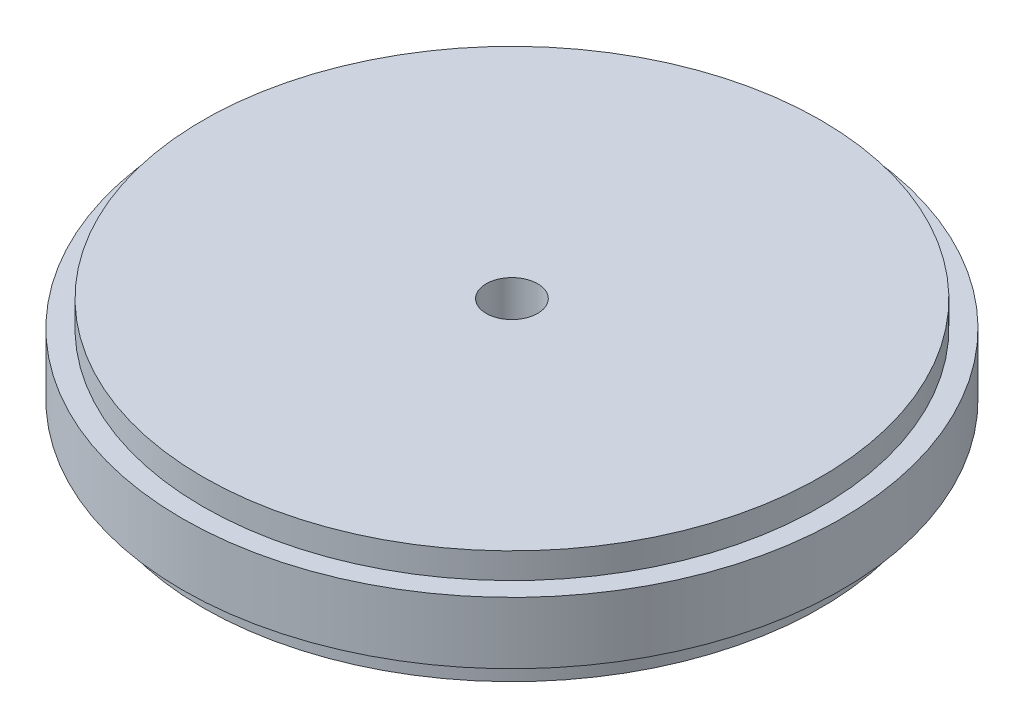
ISO-10303-21;
HEADER;
FILE_DESCRIPTION(('STEP AP214'),'2;1');
FILE_NAME('part.step','',(''),(''),'','','');
FILE_SCHEMA(('AUTOMOTIVE_DESIGN { 1 0 10303 214 1 1 1 1 }'));
ENDSEC;
DATA;
#1=APPLICATION_CONTEXT('core data for automotive mechanical design processes');
#2=APPLICATION_PROTOCOL_DEFINITION('international standard','automotive_design',2000,#1);
#3=PRODUCT_CONTEXT('',#1,'mechanical');
#4=PRODUCT('Part','Part','',(#3));
#5=PRODUCT_RELATED_PRODUCT_CATEGORY('part','',(#4));
#6=PRODUCT_DEFINITION_FORMATION('','',#4);
#7=PRODUCT_DEFINITION_CONTEXT('part definition',#1,'design');
#8=PRODUCT_DEFINITION('design','',#6,#7);
#9=PRODUCT_DEFINITION_SHAPE('','',#8);
#10=(LENGTH_UNIT() NAMED_UNIT(*) SI_UNIT(.MILLI.,.METRE.));
#11=(NAMED_UNIT(*) PLANE_ANGLE_UNIT() SI_UNIT($,.RADIAN.));
#12=(NAMED_UNIT(*) SI_UNIT($,.STERADIAN.) SOLID_ANGLE_UNIT());
#13=UNCERTAINTY_MEASURE_WITH_UNIT(LENGTH_MEASURE(1.E-05),#10,'distance_accuracy_value','');
#14=(GEOMETRIC_REPRESENTATION_CONTEXT(3) GLOBAL_UNCERTAINTY_ASSIGNED_CONTEXT((#13)) GLOBAL_UNIT_ASSIGNED_CONTEXT((#10,
#11,#12)) REPRESENTATION_CONTEXT('',''));
#15=CARTESIAN_POINT('',(0.,0.,0.));
#16=DIRECTION('',(0.,0.,1.));
#17=DIRECTION('',(1.,0.,0.));
#18=AXIS2_PLACEMENT_3D('',#15,#16,#17);
#19=CARTESIAN_POINT('',(0.,3.,0.));
#20=DIRECTION('',(0.,-1.,0.));
#21=DIRECTION('',(0.,0.,-1.));
#22=AXIS2_PLACEMENT_3D('',#19,#20,#21);
#23=CYLINDRICAL_SURFACE('',#22,32.);
#24=CARTESIAN_POINT('',(0.,3.,0.));
#25=DIRECTION('',(0.,1.,0.));
#26=DIRECTION('',(0.,0.,1.));
#27=AXIS2_PLACEMENT_3D('',#24,#25,#26);
#28=CIRCLE('',#27,32.);
#29=CARTESIAN_POINT('',(0.,3.,32.));
#30=VERTEX_POINT('',#29);
#31=EDGE_CURVE('E10',#30,#30,#28,.T.);
#32=ORIENTED_EDGE('',*,*,#31,.F.);
#33=EDGE_LOOP('',(#32));
#34=FACE_BOUND('',#33,.T.);
#35=CARTESIAN_POINT('',(0.,-3.,0.));
#36=DIRECTION('',(0.,1.,0.));
#37=DIRECTION('',(0.,0.,1.));
#38=AXIS2_PLACEMENT_3D('',#35,#36,#37);
#39=CIRCLE('',#38,32.);
#40=CARTESIAN_POINT('',(0.,-3.,32.));
#41=VERTEX_POINT('',#40);
#42=EDGE_CURVE('E40',#41,#41,#39,.T.);
#43=ORIENTED_EDGE('',*,*,#42,.T.);
#44=EDGE_LOOP('',(#43));
#45=FACE_BOUND('',#44,.T.);
#46=ADVANCED_FACE('F37',(#34,#45),#23,.T.);
#47=CARTESIAN_POINT('',(0.,3.,0.));
#48=DIRECTION('',(0.,1.,0.));
#49=DIRECTION('',(0.,0.,1.));
#50=AXIS2_PLACEMENT_3D('',#47,#48,#49);
#51=PLANE('',#50);
#52=CARTESIAN_POINT('',(0.,3.,0.));
#53=DIRECTION('',(0.,1.,0.));
#54=DIRECTION('',(0.,0.,1.));
#55=AXIS2_PLACEMENT_3D('',#52,#53,#54);
#56=CIRCLE('',#55,30.);
#57=CARTESIAN_POINT('',(0.,3.,30.));
#58=VERTEX_POINT('',#57);
#59=EDGE_CURVE('E44',#58,#58,#56,.T.);
#60=ORIENTED_EDGE('',*,*,#59,.F.);
#61=EDGE_LOOP('',(#60));
#62=FACE_BOUND('',#61,.T.);
#63=ORIENTED_EDGE('',*,*,#31,.T.);
#64=EDGE_LOOP('',(#63));
#65=FACE_BOUND('',#64,.T.);
#66=ADVANCED_FACE('F92',(#62,#65),#51,.T.);
#67=CARTESIAN_POINT('',(0.,-3.,0.));
#68=DIRECTION('',(0.,1.,0.));
#69=DIRECTION('',(0.,0.,1.));
#70=AXIS2_PLACEMENT_3D('',#67,#68,#69);
#71=PLANE('',#70);
#72=CARTESIAN_POINT('',(0.,-3.,0.));
#73=DIRECTION('',(0.,1.,0.));
#74=DIRECTION('',(0.,0.,1.));
#75=AXIS2_PLACEMENT_3D('',#72,#73,#74);
#76=CIRCLE('',#75,30.);
#77=CARTESIAN_POINT('',(0.,-3.,30.));
#78=VERTEX_POINT('',#77);
#79=EDGE_CURVE('E50',#78,#78,#76,.F.);
#80=ORIENTED_EDGE('',*,*,#79,.F.);
#81=EDGE_LOOP('',(#80));
#82=FACE_BOUND('',#81,.T.);
#83=ORIENTED_EDGE('',*,*,#42,.F.);
#84=EDGE_LOOP('',(#83));
#85=FACE_BOUND('',#84,.T.);
#86=ADVANCED_FACE('F97',(#82,#85),#71,.F.);
#87=CARTESIAN_POINT('',(0.,5.5,0.));
#88=DIRECTION('',(0.,-1.,0.));
#89=DIRECTION('',(0.,0.,-1.));
#90=AXIS2_PLACEMENT_3D('',#87,#88,#89);
#91=CYLINDRICAL_SURFACE('',#90,30.);
#92=CARTESIAN_POINT('',(0.,-5.5,0.));
#93=DIRECTION('',(0.,1.,0.));
#94=DIRECTION('',(0.,0.,1.));
#95=AXIS2_PLACEMENT_3D('',#92,#93,#94);
#96=CIRCLE('',#95,30.);
#97=CARTESIAN_POINT('',(0.,-5.5,30.));
#98=VERTEX_POINT('',#97);
#99=EDGE_CURVE('E54',#98,#98,#96,.T.);
#100=ORIENTED_EDGE('',*,*,#99,.T.);
#101=EDGE_LOOP('',(#100));
#102=FACE_BOUND('',#101,.T.);
#103=ORIENTED_EDGE('',*,*,#79,.T.);
#104=EDGE_LOOP('',(#103));
#105=FACE_BOUND('',#104,.T.);
#106=ADVANCED_FACE('F105',(#102,#105),#91,.T.);
#107=ORIENTED_EDGE('',*,*,#59,.T.);
#108=EDGE_LOOP('',(#107));
#109=FACE_BOUND('',#108,.T.);
#110=CARTESIAN_POINT('',(0.,5.5,0.));
#111=DIRECTION('',(0.,1.,0.));
#112=DIRECTION('',(0.,0.,1.));
#113=AXIS2_PLACEMENT_3D('',#110,#111,#112);
#114=CIRCLE('',#113,30.);
#115=CARTESIAN_POINT('',(0.,5.5,30.));
#116=VERTEX_POINT('',#115);
#117=EDGE_CURVE('E53',#116,#116,#114,.T.);
#118=ORIENTED_EDGE('',*,*,#117,.F.);
#119=EDGE_LOOP('',(#118));
#120=FACE_BOUND('',#119,.T.);
#121=ADVANCED_FACE('F110',(#109,#120),#91,.T.);
#122=CARTESIAN_POINT('',(0.,5.5,0.));
#123=DIRECTION('',(0.,1.,0.));
#124=DIRECTION('',(0.,0.,1.));
#125=AXIS2_PLACEMENT_3D('',#122,#123,#124);
#126=PLANE('',#125);
#127=ORIENTED_EDGE('',*,*,#117,.T.);
#128=EDGE_LOOP('',(#127));
#129=FACE_BOUND('',#128,.T.);
#130=CARTESIAN_POINT('',(0.,5.5,0.));
#131=DIRECTION('',(0.,1.,0.));
#132=DIRECTION('',(0.,0.,1.));
#133=AXIS2_PLACEMENT_3D('',#130,#131,#132);
#134=CIRCLE('',#133,2.5);
#135=CARTESIAN_POINT('',(0.,5.5,2.5));
#136=VERTEX_POINT('',#135);
#137=EDGE_CURVE('E57',#136,#136,#134,.T.);
#138=ORIENTED_EDGE('',*,*,#137,.F.);
#139=EDGE_LOOP('',(#138));
#140=FACE_BOUND('',#139,.T.);
#141=ADVANCED_FACE('F87',(#129,#140),#126,.T.);
#142=CARTESIAN_POINT('',(0.,-5.5,0.));
#143=DIRECTION('',(0.,1.,0.));
#144=DIRECTION('',(0.,0.,1.));
#145=AXIS2_PLACEMENT_3D('',#142,#143,#144);
#146=PLANE('',#145);
#147=CARTESIAN_POINT('',(0.,-5.5,0.));
#148=DIRECTION('',(0.,1.,0.));
#149=DIRECTION('',(0.,0.,1.));
#150=AXIS2_PLACEMENT_3D('',#147,#148,#149);
#151=CIRCLE('',#150,9.);
#152=CARTESIAN_POINT('',(0.,-5.5,9.));
#153=VERTEX_POINT('',#152);
#154=EDGE_CURVE('E62',#153,#153,#151,.T.);
#155=ORIENTED_EDGE('',*,*,#154,.T.);
#156=EDGE_LOOP('',(#155));
#157=FACE_BOUND('',#156,.T.);
#158=ORIENTED_EDGE('',*,*,#99,.F.);
#159=EDGE_LOOP('',(#158));
#160=FACE_BOUND('',#159,.T.);
#161=ADVANCED_FACE('F78',(#157,#160),#146,.F.);
#162=CARTESIAN_POINT('',(0.,5.5,0.));
#163=DIRECTION('',(0.,-1.,0.));
#164=DIRECTION('',(0.,0.,-1.));
#165=AXIS2_PLACEMENT_3D('',#162,#163,#164);
#166=CYLINDRICAL_SURFACE('',#165,2.5);
#167=ORIENTED_EDGE('',*,*,#137,.T.);
#168=EDGE_LOOP('',(#167));
#169=FACE_BOUND('',#168,.T.);
#170=CARTESIAN_POINT('',(0.,-14.,0.));
#171=DIRECTION('',(0.,1.,0.));
#172=DIRECTION('',(0.,0.,1.));
#173=AXIS2_PLACEMENT_3D('',#170,#171,#172);
#174=CIRCLE('',#173,2.5);
#175=CARTESIAN_POINT('',(0.,-14.,2.5));
#176=VERTEX_POINT('',#175);
#177=EDGE_CURVE('E68',#176,#176,#174,.T.);
#178=ORIENTED_EDGE('',*,*,#177,.F.);
#179=EDGE_LOOP('',(#178));
#180=FACE_BOUND('',#179,.T.);
#181=ADVANCED_FACE('F75',(#169,#180),#166,.F.);
#182=CARTESIAN_POINT('',(0.,-14.,0.));
#183=DIRECTION('',(0.,1.,0.));
#184=DIRECTION('',(0.,0.,1.));
#185=AXIS2_PLACEMENT_3D('',#182,#183,#184);
#186=CYLINDRICAL_SURFACE('',#185,9.);
#187=CARTESIAN_POINT('',(0.,-14.,0.));
#188=DIRECTION('',(0.,1.,0.));
#189=DIRECTION('',(0.,0.,1.));
#190=AXIS2_PLACEMENT_3D('',#187,#188,#189);
#191=CIRCLE('',#190,9.);
#192=CARTESIAN_POINT('',(0.,-14.,9.));
#193=VERTEX_POINT('',#192);
#194=EDGE_CURVE('E65',#193,#193,#191,.T.);
#195=ORIENTED_EDGE('',*,*,#194,.T.);
#196=EDGE_LOOP('',(#195));
#197=FACE_BOUND('',#196,.T.);
#198=ORIENTED_EDGE('',*,*,#154,.F.);
#199=EDGE_LOOP('',(#198));
#200=FACE_BOUND('',#199,.T.);
#201=ADVANCED_FACE('F77',(#197,#200),#186,.T.);
#202=CARTESIAN_POINT('',(0.,-14.,0.));
#203=DIRECTION('',(0.,1.,0.));
#204=DIRECTION('',(0.,0.,1.));
#205=AXIS2_PLACEMENT_3D('',#202,#203,#204);
#206=PLANE('',#205);
#207=ORIENTED_EDGE('',*,*,#177,.T.);
#208=EDGE_LOOP('',(#207));
#209=FACE_BOUND('',#208,.T.);
#210=ORIENTED_EDGE('',*,*,#194,.F.);
#211=EDGE_LOOP('',(#210));
#212=FACE_BOUND('',#211,.T.);
#213=ADVANCED_FACE('F72',(#209,#212),#206,.F.);
#214=CLOSED_SHELL('',(#46,#66,#86,#106,#121,#141,#161,#181,#201,#213));
#215=MANIFOLD_SOLID_BREP('B2',#214);
#216=ADVANCED_BREP_SHAPE_REPRESENTATION('',(#18,#215),#14);
#217=SHAPE_DEFINITION_REPRESENTATION(#9,#216);
ENDSEC;
END-ISO-10303-21;
